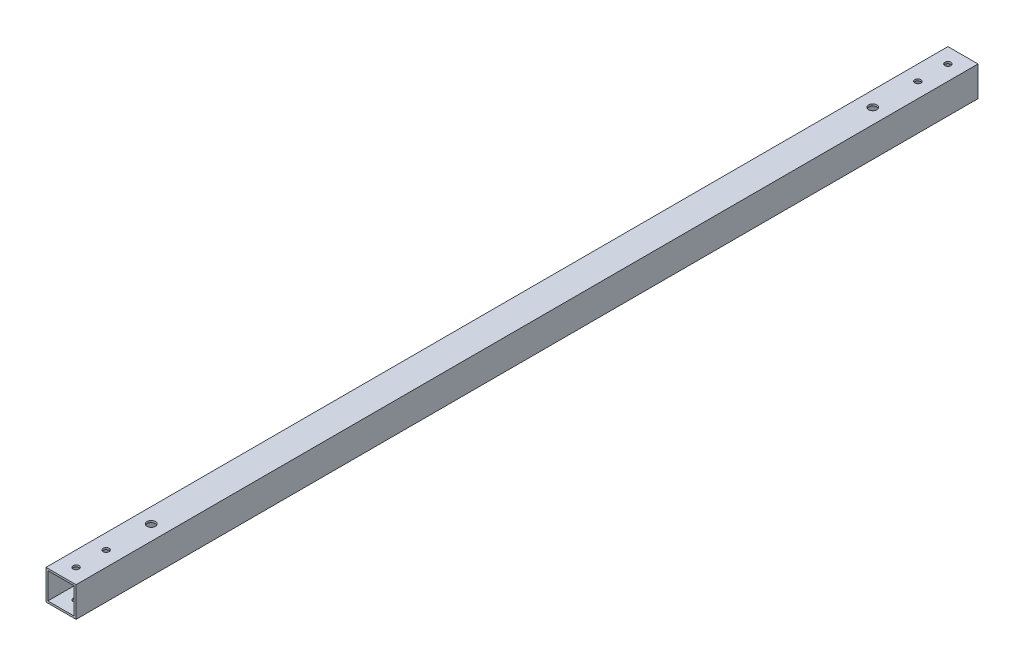
ISO-10303-21;
HEADER;
FILE_DESCRIPTION(('STEP AP214'),'2;1');
FILE_NAME('part.step','',(''),(''),'','','');
FILE_SCHEMA(('AUTOMOTIVE_DESIGN { 1 0 10303 214 1 1 1 1 }'));
ENDSEC;
DATA;
#1=APPLICATION_CONTEXT('core data for automotive mechanical design processes');
#2=APPLICATION_PROTOCOL_DEFINITION('international standard','automotive_design',2000,#1);
#3=PRODUCT_CONTEXT('',#1,'mechanical');
#4=PRODUCT('Part','Part','',(#3));
#5=PRODUCT_RELATED_PRODUCT_CATEGORY('part','',(#4));
#6=PRODUCT_DEFINITION_FORMATION('','',#4);
#7=PRODUCT_DEFINITION_CONTEXT('part definition',#1,'design');
#8=PRODUCT_DEFINITION('design','',#6,#7);
#9=PRODUCT_DEFINITION_SHAPE('','',#8);
#10=(LENGTH_UNIT() NAMED_UNIT(*) SI_UNIT(.MILLI.,.METRE.));
#11=(NAMED_UNIT(*) PLANE_ANGLE_UNIT() SI_UNIT($,.RADIAN.));
#12=(NAMED_UNIT(*) SI_UNIT($,.STERADIAN.) SOLID_ANGLE_UNIT());
#13=UNCERTAINTY_MEASURE_WITH_UNIT(LENGTH_MEASURE(1.E-05),#10,'distance_accuracy_value','');
#14=(GEOMETRIC_REPRESENTATION_CONTEXT(3) GLOBAL_UNCERTAINTY_ASSIGNED_CONTEXT((#13)) GLOBAL_UNIT_ASSIGNED_CONTEXT((#10,
#11,#12)) REPRESENTATION_CONTEXT('',''));
#15=CARTESIAN_POINT('',(0.,0.,0.));
#16=DIRECTION('',(0.,0.,1.));
#17=DIRECTION('',(1.,0.,0.));
#18=AXIS2_PLACEMENT_3D('',#15,#16,#17);
#19=CARTESIAN_POINT('',(0.,0.,762.));
#20=DIRECTION('',(0.,0.,-1.));
#21=DIRECTION('',(-1.,0.,0.));
#22=AXIS2_PLACEMENT_3D('',#19,#20,#21);
#23=PLANE('',#22);
#24=DIRECTION('',(0.,-1.,0.));
#25=VECTOR('',#24,1.);
#26=CARTESIAN_POINT('',(0.,0.,762.));
#27=LINE('',#26,#25);
#28=CARTESIAN_POINT('',(0.,25.4,762.));
#29=VERTEX_POINT('',#28);
#30=CARTESIAN_POINT('',(0.,0.,762.));
#31=VERTEX_POINT('',#30);
#32=EDGE_CURVE('E157',#29,#31,#27,.T.);
#33=ORIENTED_EDGE('',*,*,#32,.T.);
#34=DIRECTION('',(1.,0.,0.));
#35=VECTOR('',#34,1.);
#36=CARTESIAN_POINT('',(0.,0.,762.));
#37=LINE('',#36,#35);
#38=CARTESIAN_POINT('',(25.4,0.,762.));
#39=VERTEX_POINT('',#38);
#40=EDGE_CURVE('E161',#31,#39,#37,.T.);
#41=ORIENTED_EDGE('',*,*,#40,.T.);
#42=DIRECTION('',(0.,1.,0.));
#43=VECTOR('',#42,1.);
#44=CARTESIAN_POINT('',(25.4,0.,762.));
#45=LINE('',#44,#43);
#46=CARTESIAN_POINT('',(25.4,25.4,762.));
#47=VERTEX_POINT('',#46);
#48=EDGE_CURVE('E165',#39,#47,#45,.T.);
#49=ORIENTED_EDGE('',*,*,#48,.T.);
#50=DIRECTION('',(-1.,0.,0.));
#51=VECTOR('',#50,1.);
#52=CARTESIAN_POINT('',(0.,25.4,762.));
#53=LINE('',#52,#51);
#54=EDGE_CURVE('E168',#47,#29,#53,.T.);
#55=ORIENTED_EDGE('',*,*,#54,.T.);
#56=EDGE_LOOP('',(#33,#41,#49,#55));
#57=FACE_BOUND('',#56,.T.);
#58=DIRECTION('',(0.,-1.,0.));
#59=VECTOR('',#58,1.);
#60=CARTESIAN_POINT('',(1.5875,1.5875,762.));
#61=LINE('',#60,#59);
#62=CARTESIAN_POINT('',(1.5875,23.8125,762.));
#63=VERTEX_POINT('',#62);
#64=CARTESIAN_POINT('',(1.5875,1.5875,762.));
#65=VERTEX_POINT('',#64);
#66=EDGE_CURVE('E107',#63,#65,#61,.T.);
#67=ORIENTED_EDGE('',*,*,#66,.F.);
#68=DIRECTION('',(-1.,0.,0.));
#69=VECTOR('',#68,1.);
#70=CARTESIAN_POINT('',(1.5875,23.8125,762.));
#71=LINE('',#70,#69);
#72=CARTESIAN_POINT('',(23.8125,23.8125,762.));
#73=VERTEX_POINT('',#72);
#74=EDGE_CURVE('E133',#73,#63,#71,.T.);
#75=ORIENTED_EDGE('',*,*,#74,.F.);
#76=DIRECTION('',(0.,1.,0.));
#77=VECTOR('',#76,1.);
#78=CARTESIAN_POINT('',(23.8125,1.5875,762.));
#79=LINE('',#78,#77);
#80=CARTESIAN_POINT('',(23.8125,1.5875,762.));
#81=VERTEX_POINT('',#80);
#82=EDGE_CURVE('E129',#81,#73,#79,.T.);
#83=ORIENTED_EDGE('',*,*,#82,.F.);
#84=DIRECTION('',(1.,0.,0.));
#85=VECTOR('',#84,1.);
#86=CARTESIAN_POINT('',(1.5875,1.5875,762.));
#87=LINE('',#86,#85);
#88=EDGE_CURVE('E116',#65,#81,#87,.T.);
#89=ORIENTED_EDGE('',*,*,#88,.F.);
#90=EDGE_LOOP('',(#67,#75,#83,#89));
#91=FACE_BOUND('',#90,.T.);
#92=ADVANCED_FACE('F39',(#57,#91),#23,.F.);
#93=CARTESIAN_POINT('',(0.,0.,0.));
#94=DIRECTION('',(0.,0.,-1.));
#95=DIRECTION('',(-1.,0.,0.));
#96=AXIS2_PLACEMENT_3D('',#93,#94,#95);
#97=PLANE('',#96);
#98=DIRECTION('',(0.,-1.,0.));
#99=VECTOR('',#98,1.);
#100=CARTESIAN_POINT('',(0.,0.,0.));
#101=LINE('',#100,#99);
#102=CARTESIAN_POINT('',(0.,25.4,0.));
#103=VERTEX_POINT('',#102);
#104=CARTESIAN_POINT('',(0.,0.,0.));
#105=VERTEX_POINT('',#104);
#106=EDGE_CURVE('E125',#103,#105,#101,.T.);
#107=ORIENTED_EDGE('',*,*,#106,.F.);
#108=DIRECTION('',(-1.,0.,0.));
#109=VECTOR('',#108,1.);
#110=CARTESIAN_POINT('',(0.,25.4,0.));
#111=LINE('',#110,#109);
#112=CARTESIAN_POINT('',(25.4,25.4,0.));
#113=VERTEX_POINT('',#112);
#114=EDGE_CURVE('E162',#113,#103,#111,.T.);
#115=ORIENTED_EDGE('',*,*,#114,.F.);
#116=DIRECTION('',(0.,1.,0.));
#117=VECTOR('',#116,1.);
#118=CARTESIAN_POINT('',(25.4,0.,0.));
#119=LINE('',#118,#117);
#120=CARTESIAN_POINT('',(25.4,0.,0.));
#121=VERTEX_POINT('',#120);
#122=EDGE_CURVE('E178',#121,#113,#119,.T.);
#123=ORIENTED_EDGE('',*,*,#122,.F.);
#124=DIRECTION('',(1.,0.,0.));
#125=VECTOR('',#124,1.);
#126=CARTESIAN_POINT('',(0.,0.,0.));
#127=LINE('',#126,#125);
#128=EDGE_CURVE('E175',#105,#121,#127,.T.);
#129=ORIENTED_EDGE('',*,*,#128,.F.);
#130=EDGE_LOOP('',(#107,#115,#123,#129));
#131=FACE_BOUND('',#130,.T.);
#132=DIRECTION('',(-1.,0.,0.));
#133=VECTOR('',#132,1.);
#134=CARTESIAN_POINT('',(1.5875,23.8125,0.));
#135=LINE('',#134,#133);
#136=CARTESIAN_POINT('',(23.8125,23.8125,0.));
#137=VERTEX_POINT('',#136);
#138=CARTESIAN_POINT('',(1.5875,23.8125,0.));
#139=VERTEX_POINT('',#138);
#140=EDGE_CURVE('E117',#137,#139,#135,.T.);
#141=ORIENTED_EDGE('',*,*,#140,.T.);
#142=DIRECTION('',(0.,-1.,0.));
#143=VECTOR('',#142,1.);
#144=CARTESIAN_POINT('',(1.5875,1.5875,0.));
#145=LINE('',#144,#143);
#146=CARTESIAN_POINT('',(1.5875,1.5875,0.));
#147=VERTEX_POINT('',#146);
#148=EDGE_CURVE('E65',#139,#147,#145,.T.);
#149=ORIENTED_EDGE('',*,*,#148,.T.);
#150=DIRECTION('',(1.,0.,0.));
#151=VECTOR('',#150,1.);
#152=CARTESIAN_POINT('',(1.5875,1.5875,0.));
#153=LINE('',#152,#151);
#154=CARTESIAN_POINT('',(23.8125,1.5875,0.));
#155=VERTEX_POINT('',#154);
#156=EDGE_CURVE('E123',#147,#155,#153,.T.);
#157=ORIENTED_EDGE('',*,*,#156,.T.);
#158=DIRECTION('',(0.,1.,0.));
#159=VECTOR('',#158,1.);
#160=CARTESIAN_POINT('',(23.8125,1.5875,0.));
#161=LINE('',#160,#159);
#162=EDGE_CURVE('E144',#155,#137,#161,.T.);
#163=ORIENTED_EDGE('',*,*,#162,.T.);
#164=EDGE_LOOP('',(#141,#149,#157,#163));
#165=FACE_BOUND('',#164,.T.);
#166=ADVANCED_FACE('F256',(#131,#165),#97,.T.);
#167=CARTESIAN_POINT('',(0.,0.,762.));
#168=DIRECTION('',(1.,0.,0.));
#169=DIRECTION('',(0.,0.,-1.));
#170=AXIS2_PLACEMENT_3D('',#167,#168,#169);
#171=PLANE('',#170);
#172=ORIENTED_EDGE('',*,*,#106,.T.);
#173=DIRECTION('',(0.,0.,-1.));
#174=VECTOR('',#173,1.);
#175=CARTESIAN_POINT('',(0.,0.,762.));
#176=LINE('',#175,#174);
#177=EDGE_CURVE('E11',#31,#105,#176,.T.);
#178=ORIENTED_EDGE('',*,*,#177,.F.);
#179=ORIENTED_EDGE('',*,*,#32,.F.);
#180=DIRECTION('',(0.,0.,-1.));
#181=VECTOR('',#180,1.);
#182=CARTESIAN_POINT('',(0.,25.4,762.));
#183=LINE('',#182,#181);
#184=EDGE_CURVE('E171',#29,#103,#183,.T.);
#185=ORIENTED_EDGE('',*,*,#184,.T.);
#186=EDGE_LOOP('',(#172,#178,#179,#185));
#187=FACE_BOUND('',#186,.T.);
#188=ADVANCED_FACE('F41',(#187),#171,.F.);
#189=CARTESIAN_POINT('',(0.,0.,762.));
#190=DIRECTION('',(0.,1.,0.));
#191=DIRECTION('',(0.,0.,1.));
#192=AXIS2_PLACEMENT_3D('',#189,#190,#191);
#193=PLANE('',#192);
#194=CARTESIAN_POINT('',(12.7,0.,38.1));
#195=DIRECTION('',(0.,1.,0.));
#196=DIRECTION('',(0.,0.,1.));
#197=AXIS2_PLACEMENT_3D('',#194,#195,#196);
#198=CIRCLE('',#197,2.54);
#199=CARTESIAN_POINT('',(12.7,0.,40.64));
#200=VERTEX_POINT('',#199);
#201=EDGE_CURVE('E292',#200,#200,#198,.T.);
#202=ORIENTED_EDGE('',*,*,#201,.T.);
#203=EDGE_LOOP('',(#202));
#204=FACE_BOUND('',#203,.T.);
#205=CARTESIAN_POINT('',(12.7,0.,749.3));
#206=DIRECTION('',(0.,1.,0.));
#207=DIRECTION('',(0.,0.,-1.));
#208=AXIS2_PLACEMENT_3D('',#205,#206,#207);
#209=CIRCLE('',#208,2.53999999999997);
#210=CARTESIAN_POINT('',(12.7,0.,746.76));
#211=VERTEX_POINT('',#210);
#212=EDGE_CURVE('E296',#211,#211,#209,.T.);
#213=ORIENTED_EDGE('',*,*,#212,.T.);
#214=EDGE_LOOP('',(#213));
#215=FACE_BOUND('',#214,.T.);
#216=CARTESIAN_POINT('',(12.7,0.,723.9));
#217=DIRECTION('',(0.,1.,0.));
#218=DIRECTION('',(0.,0.,-1.));
#219=AXIS2_PLACEMENT_3D('',#216,#217,#218);
#220=CIRCLE('',#219,2.53999999999997);
#221=CARTESIAN_POINT('',(12.7,0.,721.36));
#222=VERTEX_POINT('',#221);
#223=EDGE_CURVE('E300',#222,#222,#220,.T.);
#224=ORIENTED_EDGE('',*,*,#223,.T.);
#225=EDGE_LOOP('',(#224));
#226=FACE_BOUND('',#225,.T.);
#227=CARTESIAN_POINT('',(12.7,0.,12.7));
#228=DIRECTION('',(0.,1.,0.));
#229=DIRECTION('',(0.,0.,1.));
#230=AXIS2_PLACEMENT_3D('',#227,#228,#229);
#231=CIRCLE('',#230,2.54);
#232=CARTESIAN_POINT('',(12.7,0.,15.24));
#233=VERTEX_POINT('',#232);
#234=EDGE_CURVE('E304',#233,#233,#231,.T.);
#235=ORIENTED_EDGE('',*,*,#234,.T.);
#236=EDGE_LOOP('',(#235));
#237=FACE_BOUND('',#236,.T.);
#238=CARTESIAN_POINT('',(12.7,0.,76.2));
#239=DIRECTION('',(0.,1.,0.));
#240=DIRECTION('',(0.,0.,1.));
#241=AXIS2_PLACEMENT_3D('',#238,#239,#240);
#242=CIRCLE('',#241,3.556);
#243=CARTESIAN_POINT('',(12.7,0.,79.756));
#244=VERTEX_POINT('',#243);
#245=EDGE_CURVE('E308',#244,#244,#242,.T.);
#246=ORIENTED_EDGE('',*,*,#245,.T.);
#247=EDGE_LOOP('',(#246));
#248=FACE_BOUND('',#247,.T.);
#249=CARTESIAN_POINT('',(12.7,0.,685.8));
#250=DIRECTION('',(0.,1.,0.));
#251=DIRECTION('',(0.,0.,-1.));
#252=AXIS2_PLACEMENT_3D('',#249,#250,#251);
#253=CIRCLE('',#252,3.55600000000003);
#254=CARTESIAN_POINT('',(12.7,0.,682.244));
#255=VERTEX_POINT('',#254);
#256=EDGE_CURVE('E198',#255,#255,#253,.T.);
#257=ORIENTED_EDGE('',*,*,#256,.T.);
#258=EDGE_LOOP('',(#257));
#259=FACE_BOUND('',#258,.T.);
#260=ORIENTED_EDGE('',*,*,#128,.T.);
#261=DIRECTION('',(0.,0.,-1.));
#262=VECTOR('',#261,1.);
#263=CARTESIAN_POINT('',(25.4,0.,762.));
#264=LINE('',#263,#262);
#265=EDGE_CURVE('E49',#39,#121,#264,.T.);
#266=ORIENTED_EDGE('',*,*,#265,.F.);
#267=ORIENTED_EDGE('',*,*,#40,.F.);
#268=ORIENTED_EDGE('',*,*,#177,.T.);
#269=EDGE_LOOP('',(#260,#266,#267,#268));
#270=FACE_BOUND('',#269,.T.);
#271=ADVANCED_FACE('F281',(#204,#215,#226,#237,#248,#259,#270),#193,.F.);
#272=CARTESIAN_POINT('',(25.4,0.,762.));
#273=DIRECTION('',(-1.,0.,0.));
#274=DIRECTION('',(0.,0.,1.));
#275=AXIS2_PLACEMENT_3D('',#272,#273,#274);
#276=PLANE('',#275);
#277=ORIENTED_EDGE('',*,*,#122,.T.);
#278=DIRECTION('',(0.,0.,-1.));
#279=VECTOR('',#278,1.);
#280=CARTESIAN_POINT('',(25.4,25.4,762.));
#281=LINE('',#280,#279);
#282=EDGE_CURVE('E186',#47,#113,#281,.T.);
#283=ORIENTED_EDGE('',*,*,#282,.F.);
#284=ORIENTED_EDGE('',*,*,#48,.F.);
#285=ORIENTED_EDGE('',*,*,#265,.T.);
#286=EDGE_LOOP('',(#277,#283,#284,#285));
#287=FACE_BOUND('',#286,.T.);
#288=ADVANCED_FACE('F278',(#287),#276,.F.);
#289=CARTESIAN_POINT('',(0.,25.4,762.));
#290=DIRECTION('',(0.,-1.,0.));
#291=DIRECTION('',(0.,0.,-1.));
#292=AXIS2_PLACEMENT_3D('',#289,#290,#291);
#293=PLANE('',#292);
#294=CARTESIAN_POINT('',(12.7,25.4,38.1));
#295=DIRECTION('',(0.,1.,0.));
#296=DIRECTION('',(0.,0.,1.));
#297=AXIS2_PLACEMENT_3D('',#294,#295,#296);
#298=CIRCLE('',#297,2.54);
#299=CARTESIAN_POINT('',(12.7,25.4,40.64));
#300=VERTEX_POINT('',#299);
#301=EDGE_CURVE('E404',#300,#300,#298,.T.);
#302=ORIENTED_EDGE('',*,*,#301,.F.);
#303=EDGE_LOOP('',(#302));
#304=FACE_BOUND('',#303,.T.);
#305=CARTESIAN_POINT('',(12.7,25.4,749.3));
#306=DIRECTION('',(0.,1.,0.));
#307=DIRECTION('',(0.,0.,-1.));
#308=AXIS2_PLACEMENT_3D('',#305,#306,#307);
#309=CIRCLE('',#308,2.53999999999997);
#310=CARTESIAN_POINT('',(12.7,25.4,746.76));
#311=VERTEX_POINT('',#310);
#312=EDGE_CURVE('E410',#311,#311,#309,.T.);
#313=ORIENTED_EDGE('',*,*,#312,.F.);
#314=EDGE_LOOP('',(#313));
#315=FACE_BOUND('',#314,.T.);
#316=CARTESIAN_POINT('',(12.7,25.4,723.9));
#317=DIRECTION('',(0.,1.,0.));
#318=DIRECTION('',(0.,0.,-1.));
#319=AXIS2_PLACEMENT_3D('',#316,#317,#318);
#320=CIRCLE('',#319,2.53999999999997);
#321=CARTESIAN_POINT('',(12.7,25.4,721.36));
#322=VERTEX_POINT('',#321);
#323=EDGE_CURVE('E331',#322,#322,#320,.T.);
#324=ORIENTED_EDGE('',*,*,#323,.F.);
#325=EDGE_LOOP('',(#324));
#326=FACE_BOUND('',#325,.T.);
#327=CARTESIAN_POINT('',(12.7,25.4,12.7));
#328=DIRECTION('',(0.,1.,0.));
#329=DIRECTION('',(0.,0.,1.));
#330=AXIS2_PLACEMENT_3D('',#327,#328,#329);
#331=CIRCLE('',#330,2.54);
#332=CARTESIAN_POINT('',(12.7,25.4,15.24));
#333=VERTEX_POINT('',#332);
#334=EDGE_CURVE('E395',#333,#333,#331,.T.);
#335=ORIENTED_EDGE('',*,*,#334,.F.);
#336=EDGE_LOOP('',(#335));
#337=FACE_BOUND('',#336,.T.);
#338=CARTESIAN_POINT('',(12.7,25.4,76.2));
#339=DIRECTION('',(0.,1.,0.));
#340=DIRECTION('',(0.,0.,1.));
#341=AXIS2_PLACEMENT_3D('',#338,#339,#340);
#342=CIRCLE('',#341,3.556);
#343=CARTESIAN_POINT('',(12.7,25.4,79.756));
#344=VERTEX_POINT('',#343);
#345=EDGE_CURVE('E416',#344,#344,#342,.T.);
#346=ORIENTED_EDGE('',*,*,#345,.F.);
#347=EDGE_LOOP('',(#346));
#348=FACE_BOUND('',#347,.T.);
#349=CARTESIAN_POINT('',(12.7,25.4,685.8));
#350=DIRECTION('',(0.,1.,0.));
#351=DIRECTION('',(0.,0.,-1.));
#352=AXIS2_PLACEMENT_3D('',#349,#350,#351);
#353=CIRCLE('',#352,3.55600000000003);
#354=CARTESIAN_POINT('',(12.7,25.4,682.244));
#355=VERTEX_POINT('',#354);
#356=EDGE_CURVE('E325',#355,#355,#353,.T.);
#357=ORIENTED_EDGE('',*,*,#356,.F.);
#358=EDGE_LOOP('',(#357));
#359=FACE_BOUND('',#358,.T.);
#360=ORIENTED_EDGE('',*,*,#114,.T.);
#361=ORIENTED_EDGE('',*,*,#184,.F.);
#362=ORIENTED_EDGE('',*,*,#54,.F.);
#363=ORIENTED_EDGE('',*,*,#282,.T.);
#364=EDGE_LOOP('',(#360,#361,#362,#363));
#365=FACE_BOUND('',#364,.T.);
#366=ADVANCED_FACE('F275',(#304,#315,#326,#337,#348,#359,#365),#293,.F.);
#367=CARTESIAN_POINT('',(1.5875,1.5875,762.));
#368=DIRECTION('',(1.,0.,0.));
#369=DIRECTION('',(0.,0.,-1.));
#370=AXIS2_PLACEMENT_3D('',#367,#368,#369);
#371=PLANE('',#370);
#372=ORIENTED_EDGE('',*,*,#148,.F.);
#373=DIRECTION('',(0.,0.,-1.));
#374=VECTOR('',#373,1.);
#375=CARTESIAN_POINT('',(1.5875,23.8125,762.));
#376=LINE('',#375,#374);
#377=EDGE_CURVE('E111',#63,#139,#376,.T.);
#378=ORIENTED_EDGE('',*,*,#377,.F.);
#379=ORIENTED_EDGE('',*,*,#66,.T.);
#380=DIRECTION('',(0.,0.,-1.));
#381=VECTOR('',#380,1.);
#382=CARTESIAN_POINT('',(1.5875,1.5875,762.));
#383=LINE('',#382,#381);
#384=EDGE_CURVE('E110',#65,#147,#383,.T.);
#385=ORIENTED_EDGE('',*,*,#384,.T.);
#386=EDGE_LOOP('',(#372,#378,#379,#385));
#387=FACE_BOUND('',#386,.T.);
#388=ADVANCED_FACE('F109',(#387),#371,.T.);
#389=CARTESIAN_POINT('',(1.5875,1.5875,762.));
#390=DIRECTION('',(0.,1.,0.));
#391=DIRECTION('',(0.,0.,1.));
#392=AXIS2_PLACEMENT_3D('',#389,#390,#391);
#393=PLANE('',#392);
#394=CARTESIAN_POINT('',(12.7,1.5875,38.1));
#395=DIRECTION('',(0.,1.,0.));
#396=DIRECTION('',(0.,0.,1.));
#397=AXIS2_PLACEMENT_3D('',#394,#395,#396);
#398=CIRCLE('',#397,2.54);
#399=CARTESIAN_POINT('',(12.7,1.5875,40.64));
#400=VERTEX_POINT('',#399);
#401=EDGE_CURVE('E141',#400,#400,#398,.T.);
#402=ORIENTED_EDGE('',*,*,#401,.F.);
#403=EDGE_LOOP('',(#402));
#404=FACE_BOUND('',#403,.T.);
#405=CARTESIAN_POINT('',(12.7,1.5875,749.3));
#406=DIRECTION('',(0.,1.,0.));
#407=DIRECTION('',(0.,0.,1.));
#408=AXIS2_PLACEMENT_3D('',#405,#406,#407);
#409=CIRCLE('',#408,2.53999999999997);
#410=CARTESIAN_POINT('',(12.7,1.5875,751.84));
#411=VERTEX_POINT('',#410);
#412=EDGE_CURVE('E216',#411,#411,#409,.T.);
#413=ORIENTED_EDGE('',*,*,#412,.F.);
#414=EDGE_LOOP('',(#413));
#415=FACE_BOUND('',#414,.T.);
#416=CARTESIAN_POINT('',(12.7,1.5875,723.9));
#417=DIRECTION('',(0.,1.,0.));
#418=DIRECTION('',(0.,0.,1.));
#419=AXIS2_PLACEMENT_3D('',#416,#417,#418);
#420=CIRCLE('',#419,2.53999999999997);
#421=CARTESIAN_POINT('',(12.7,1.5875,726.44));
#422=VERTEX_POINT('',#421);
#423=EDGE_CURVE('E212',#422,#422,#420,.T.);
#424=ORIENTED_EDGE('',*,*,#423,.F.);
#425=EDGE_LOOP('',(#424));
#426=FACE_BOUND('',#425,.T.);
#427=CARTESIAN_POINT('',(12.7,1.5875,12.7));
#428=DIRECTION('',(0.,1.,0.));
#429=DIRECTION('',(0.,0.,1.));
#430=AXIS2_PLACEMENT_3D('',#427,#428,#429);
#431=CIRCLE('',#430,2.54);
#432=CARTESIAN_POINT('',(12.7,1.5875,15.24));
#433=VERTEX_POINT('',#432);
#434=EDGE_CURVE('E208',#433,#433,#431,.T.);
#435=ORIENTED_EDGE('',*,*,#434,.F.);
#436=EDGE_LOOP('',(#435));
#437=FACE_BOUND('',#436,.T.);
#438=CARTESIAN_POINT('',(12.7,1.5875,76.2));
#439=DIRECTION('',(0.,1.,0.));
#440=DIRECTION('',(0.,0.,1.));
#441=AXIS2_PLACEMENT_3D('',#438,#439,#440);
#442=CIRCLE('',#441,3.556);
#443=CARTESIAN_POINT('',(12.7,1.5875,79.756));
#444=VERTEX_POINT('',#443);
#445=EDGE_CURVE('E203',#444,#444,#442,.T.);
#446=ORIENTED_EDGE('',*,*,#445,.F.);
#447=EDGE_LOOP('',(#446));
#448=FACE_BOUND('',#447,.T.);
#449=CARTESIAN_POINT('',(12.7,1.5875,685.8));
#450=DIRECTION('',(0.,1.,0.));
#451=DIRECTION('',(0.,0.,1.));
#452=AXIS2_PLACEMENT_3D('',#449,#450,#451);
#453=CIRCLE('',#452,3.55600000000003);
#454=CARTESIAN_POINT('',(12.7,1.5875,689.356));
#455=VERTEX_POINT('',#454);
#456=EDGE_CURVE('E197',#455,#455,#453,.T.);
#457=ORIENTED_EDGE('',*,*,#456,.F.);
#458=EDGE_LOOP('',(#457));
#459=FACE_BOUND('',#458,.T.);
#460=ORIENTED_EDGE('',*,*,#156,.F.);
#461=ORIENTED_EDGE('',*,*,#384,.F.);
#462=ORIENTED_EDGE('',*,*,#88,.T.);
#463=DIRECTION('',(0.,0.,-1.));
#464=VECTOR('',#463,1.);
#465=CARTESIAN_POINT('',(23.8125,1.5875,762.));
#466=LINE('',#465,#464);
#467=EDGE_CURVE('E126',#81,#155,#466,.T.);
#468=ORIENTED_EDGE('',*,*,#467,.T.);
#469=EDGE_LOOP('',(#460,#461,#462,#468));
#470=FACE_BOUND('',#469,.T.);
#471=ADVANCED_FACE('F120',(#404,#415,#426,#437,#448,#459,#470),#393,.T.);
#472=CARTESIAN_POINT('',(23.8125,1.5875,762.));
#473=DIRECTION('',(-1.,0.,0.));
#474=DIRECTION('',(0.,0.,1.));
#475=AXIS2_PLACEMENT_3D('',#472,#473,#474);
#476=PLANE('',#475);
#477=ORIENTED_EDGE('',*,*,#162,.F.);
#478=ORIENTED_EDGE('',*,*,#467,.F.);
#479=ORIENTED_EDGE('',*,*,#82,.T.);
#480=DIRECTION('',(0.,0.,-1.));
#481=VECTOR('',#480,1.);
#482=CARTESIAN_POINT('',(23.8125,23.8125,762.));
#483=LINE('',#482,#481);
#484=EDGE_CURVE('E57',#73,#137,#483,.T.);
#485=ORIENTED_EDGE('',*,*,#484,.T.);
#486=EDGE_LOOP('',(#477,#478,#479,#485));
#487=FACE_BOUND('',#486,.T.);
#488=ADVANCED_FACE('F244',(#487),#476,.T.);
#489=CARTESIAN_POINT('',(1.5875,23.8125,762.));
#490=DIRECTION('',(0.,-1.,0.));
#491=DIRECTION('',(0.,0.,-1.));
#492=AXIS2_PLACEMENT_3D('',#489,#490,#491);
#493=PLANE('',#492);
#494=CARTESIAN_POINT('',(12.7,23.8125,38.1));
#495=DIRECTION('',(0.,-1.,0.));
#496=DIRECTION('',(0.,0.,-1.));
#497=AXIS2_PLACEMENT_3D('',#494,#495,#496);
#498=CIRCLE('',#497,2.54);
#499=CARTESIAN_POINT('',(12.7,23.8125,35.56));
#500=VERTEX_POINT('',#499);
#501=EDGE_CURVE('E43',#500,#500,#498,.T.);
#502=ORIENTED_EDGE('',*,*,#501,.F.);
#503=EDGE_LOOP('',(#502));
#504=FACE_BOUND('',#503,.T.);
#505=CARTESIAN_POINT('',(12.7,23.8125,749.3));
#506=DIRECTION('',(0.,-1.,0.));
#507=DIRECTION('',(0.,0.,-1.));
#508=AXIS2_PLACEMENT_3D('',#505,#506,#507);
#509=CIRCLE('',#508,2.53999999999997);
#510=CARTESIAN_POINT('',(12.7,23.8125,746.76));
#511=VERTEX_POINT('',#510);
#512=EDGE_CURVE('E213',#511,#511,#509,.T.);
#513=ORIENTED_EDGE('',*,*,#512,.F.);
#514=EDGE_LOOP('',(#513));
#515=FACE_BOUND('',#514,.T.);
#516=CARTESIAN_POINT('',(12.7,23.8125,723.9));
#517=DIRECTION('',(0.,-1.,0.));
#518=DIRECTION('',(0.,0.,-1.));
#519=AXIS2_PLACEMENT_3D('',#516,#517,#518);
#520=CIRCLE('',#519,2.53999999999997);
#521=CARTESIAN_POINT('',(12.7,23.8125,721.36));
#522=VERTEX_POINT('',#521);
#523=EDGE_CURVE('E209',#522,#522,#520,.T.);
#524=ORIENTED_EDGE('',*,*,#523,.F.);
#525=EDGE_LOOP('',(#524));
#526=FACE_BOUND('',#525,.T.);
#527=CARTESIAN_POINT('',(12.7,23.8125,12.7));
#528=DIRECTION('',(0.,-1.,0.));
#529=DIRECTION('',(0.,0.,-1.));
#530=AXIS2_PLACEMENT_3D('',#527,#528,#529);
#531=CIRCLE('',#530,2.54);
#532=CARTESIAN_POINT('',(12.7,23.8125,10.16));
#533=VERTEX_POINT('',#532);
#534=EDGE_CURVE('E204',#533,#533,#531,.T.);
#535=ORIENTED_EDGE('',*,*,#534,.F.);
#536=EDGE_LOOP('',(#535));
#537=FACE_BOUND('',#536,.T.);
#538=CARTESIAN_POINT('',(12.7,23.8125,76.2));
#539=DIRECTION('',(0.,-1.,0.));
#540=DIRECTION('',(0.,0.,-1.));
#541=AXIS2_PLACEMENT_3D('',#538,#539,#540);
#542=CIRCLE('',#541,3.556);
#543=CARTESIAN_POINT('',(12.7,23.8125,72.644));
#544=VERTEX_POINT('',#543);
#545=EDGE_CURVE('E199',#544,#544,#542,.T.);
#546=ORIENTED_EDGE('',*,*,#545,.F.);
#547=EDGE_LOOP('',(#546));
#548=FACE_BOUND('',#547,.T.);
#549=CARTESIAN_POINT('',(12.7,23.8125,685.8));
#550=DIRECTION('',(0.,-1.,0.));
#551=DIRECTION('',(0.,0.,-1.));
#552=AXIS2_PLACEMENT_3D('',#549,#550,#551);
#553=CIRCLE('',#552,3.55600000000003);
#554=CARTESIAN_POINT('',(12.7,23.8125,682.244));
#555=VERTEX_POINT('',#554);
#556=EDGE_CURVE('E193',#555,#555,#553,.T.);
#557=ORIENTED_EDGE('',*,*,#556,.F.);
#558=EDGE_LOOP('',(#557));
#559=FACE_BOUND('',#558,.T.);
#560=ORIENTED_EDGE('',*,*,#140,.F.);
#561=ORIENTED_EDGE('',*,*,#484,.F.);
#562=ORIENTED_EDGE('',*,*,#74,.T.);
#563=ORIENTED_EDGE('',*,*,#377,.T.);
#564=EDGE_LOOP('',(#560,#561,#562,#563));
#565=FACE_BOUND('',#564,.T.);
#566=ADVANCED_FACE('F240',(#504,#515,#526,#537,#548,#559,#565),#493,.T.);
#567=CARTESIAN_POINT('',(12.7,0.,685.8));
#568=DIRECTION('',(0.,1.,0.));
#569=DIRECTION('',(0.,0.,1.));
#570=AXIS2_PLACEMENT_3D('',#567,#568,#569);
#571=CYLINDRICAL_SURFACE('',#570,3.55600000000003);
#572=ORIENTED_EDGE('',*,*,#556,.T.);
#573=EDGE_LOOP('',(#572));
#574=FACE_BOUND('',#573,.T.);
#575=ORIENTED_EDGE('',*,*,#356,.T.);
#576=EDGE_LOOP('',(#575));
#577=FACE_BOUND('',#576,.T.);
#578=ADVANCED_FACE('F243',(#574,#577),#571,.F.);
#579=CARTESIAN_POINT('',(12.7,0.,76.2));
#580=DIRECTION('',(0.,1.,0.));
#581=DIRECTION('',(0.,0.,1.));
#582=AXIS2_PLACEMENT_3D('',#579,#580,#581);
#583=CYLINDRICAL_SURFACE('',#582,3.556);
#584=ORIENTED_EDGE('',*,*,#545,.T.);
#585=EDGE_LOOP('',(#584));
#586=FACE_BOUND('',#585,.T.);
#587=ORIENTED_EDGE('',*,*,#345,.T.);
#588=EDGE_LOOP('',(#587));
#589=FACE_BOUND('',#588,.T.);
#590=ADVANCED_FACE('F355',(#586,#589),#583,.F.);
#591=CARTESIAN_POINT('',(12.7,0.,12.7));
#592=DIRECTION('',(0.,1.,0.));
#593=DIRECTION('',(0.,0.,1.));
#594=AXIS2_PLACEMENT_3D('',#591,#592,#593);
#595=CYLINDRICAL_SURFACE('',#594,2.54);
#596=ORIENTED_EDGE('',*,*,#534,.T.);
#597=EDGE_LOOP('',(#596));
#598=FACE_BOUND('',#597,.T.);
#599=ORIENTED_EDGE('',*,*,#334,.T.);
#600=EDGE_LOOP('',(#599));
#601=FACE_BOUND('',#600,.T.);
#602=ADVANCED_FACE('F365',(#598,#601),#595,.F.);
#603=CARTESIAN_POINT('',(12.7,0.,723.9));
#604=DIRECTION('',(0.,1.,0.));
#605=DIRECTION('',(0.,0.,1.));
#606=AXIS2_PLACEMENT_3D('',#603,#604,#605);
#607=CYLINDRICAL_SURFACE('',#606,2.53999999999997);
#608=ORIENTED_EDGE('',*,*,#523,.T.);
#609=EDGE_LOOP('',(#608));
#610=FACE_BOUND('',#609,.T.);
#611=ORIENTED_EDGE('',*,*,#323,.T.);
#612=EDGE_LOOP('',(#611));
#613=FACE_BOUND('',#612,.T.);
#614=ADVANCED_FACE('F373',(#610,#613),#607,.F.);
#615=CARTESIAN_POINT('',(12.7,0.,749.3));
#616=DIRECTION('',(0.,1.,0.));
#617=DIRECTION('',(0.,0.,1.));
#618=AXIS2_PLACEMENT_3D('',#615,#616,#617);
#619=CYLINDRICAL_SURFACE('',#618,2.53999999999997);
#620=ORIENTED_EDGE('',*,*,#512,.T.);
#621=EDGE_LOOP('',(#620));
#622=FACE_BOUND('',#621,.T.);
#623=ORIENTED_EDGE('',*,*,#312,.T.);
#624=EDGE_LOOP('',(#623));
#625=FACE_BOUND('',#624,.T.);
#626=ADVANCED_FACE('F356',(#622,#625),#619,.F.);
#627=CARTESIAN_POINT('',(12.7,0.,38.1));
#628=DIRECTION('',(0.,1.,0.));
#629=DIRECTION('',(0.,0.,1.));
#630=AXIS2_PLACEMENT_3D('',#627,#628,#629);
#631=CYLINDRICAL_SURFACE('',#630,2.54);
#632=ORIENTED_EDGE('',*,*,#501,.T.);
#633=EDGE_LOOP('',(#632));
#634=FACE_BOUND('',#633,.T.);
#635=ORIENTED_EDGE('',*,*,#301,.T.);
#636=EDGE_LOOP('',(#635));
#637=FACE_BOUND('',#636,.T.);
#638=ADVANCED_FACE('F237',(#634,#637),#631,.F.);
#639=ORIENTED_EDGE('',*,*,#456,.T.);
#640=EDGE_LOOP('',(#639));
#641=FACE_BOUND('',#640,.T.);
#642=ORIENTED_EDGE('',*,*,#256,.F.);
#643=EDGE_LOOP('',(#642));
#644=FACE_BOUND('',#643,.T.);
#645=ADVANCED_FACE('F346',(#641,#644),#571,.F.);
#646=ORIENTED_EDGE('',*,*,#445,.T.);
#647=EDGE_LOOP('',(#646));
#648=FACE_BOUND('',#647,.T.);
#649=ORIENTED_EDGE('',*,*,#245,.F.);
#650=EDGE_LOOP('',(#649));
#651=FACE_BOUND('',#650,.T.);
#652=ADVANCED_FACE('F340',(#648,#651),#583,.F.);
#653=ORIENTED_EDGE('',*,*,#434,.T.);
#654=EDGE_LOOP('',(#653));
#655=FACE_BOUND('',#654,.T.);
#656=ORIENTED_EDGE('',*,*,#234,.F.);
#657=EDGE_LOOP('',(#656));
#658=FACE_BOUND('',#657,.T.);
#659=ADVANCED_FACE('F353',(#655,#658),#595,.F.);
#660=ORIENTED_EDGE('',*,*,#423,.T.);
#661=EDGE_LOOP('',(#660));
#662=FACE_BOUND('',#661,.T.);
#663=ORIENTED_EDGE('',*,*,#223,.F.);
#664=EDGE_LOOP('',(#663));
#665=FACE_BOUND('',#664,.T.);
#666=ADVANCED_FACE('F382',(#662,#665),#607,.F.);
#667=ORIENTED_EDGE('',*,*,#412,.T.);
#668=EDGE_LOOP('',(#667));
#669=FACE_BOUND('',#668,.T.);
#670=ORIENTED_EDGE('',*,*,#212,.F.);
#671=EDGE_LOOP('',(#670));
#672=FACE_BOUND('',#671,.T.);
#673=ADVANCED_FACE('F379',(#669,#672),#619,.F.);
#674=ORIENTED_EDGE('',*,*,#401,.T.);
#675=EDGE_LOOP('',(#674));
#676=FACE_BOUND('',#675,.T.);
#677=ORIENTED_EDGE('',*,*,#201,.F.);
#678=EDGE_LOOP('',(#677));
#679=FACE_BOUND('',#678,.T.);
#680=ADVANCED_FACE('F358',(#676,#679),#631,.F.);
#681=CLOSED_SHELL('',(#92,#166,#188,#271,#288,#366,#388,#471,#488,#566,#578,#590,#602,#614,#626,
#638,#645,#652,#659,#666,#673,#680));
#682=MANIFOLD_SOLID_BREP('B2',#681);
#683=ADVANCED_BREP_SHAPE_REPRESENTATION('',(#18,#682),#14);
#684=SHAPE_DEFINITION_REPRESENTATION(#9,#683);
ENDSEC;
END-ISO-10303-21;
